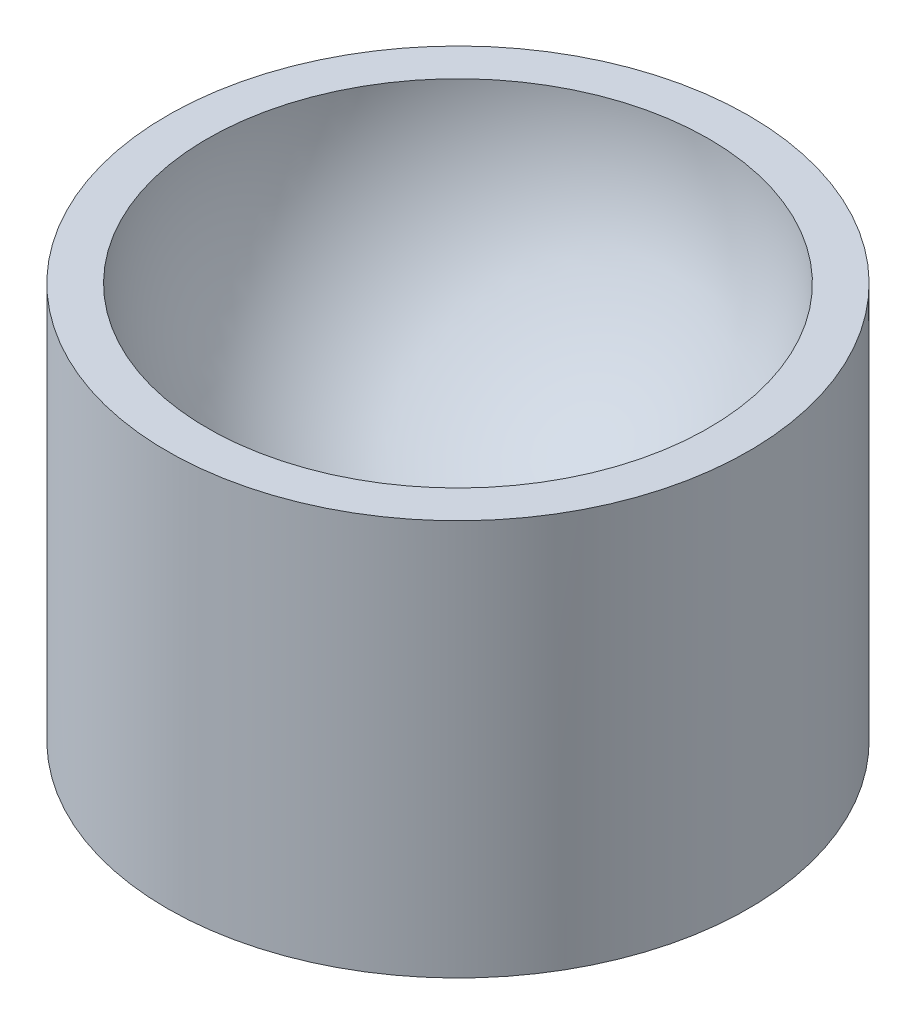
ISO-10303-21;
HEADER;
FILE_DESCRIPTION(('STEP AP214'),'2;1');
FILE_NAME('part.step','',(''),(''),'','','');
FILE_SCHEMA(('AUTOMOTIVE_DESIGN { 1 0 10303 214 1 1 1 1 }'));
ENDSEC;
DATA;
#1=APPLICATION_CONTEXT('core data for automotive mechanical design processes');
#2=APPLICATION_PROTOCOL_DEFINITION('international standard','automotive_design',2000,#1);
#3=PRODUCT_CONTEXT('',#1,'mechanical');
#4=PRODUCT('Part','Part','',(#3));
#5=PRODUCT_RELATED_PRODUCT_CATEGORY('part','',(#4));
#6=PRODUCT_DEFINITION_FORMATION('','',#4);
#7=PRODUCT_DEFINITION_CONTEXT('part definition',#1,'design');
#8=PRODUCT_DEFINITION('design','',#6,#7);
#9=PRODUCT_DEFINITION_SHAPE('','',#8);
#10=(LENGTH_UNIT() NAMED_UNIT(*) SI_UNIT(.MILLI.,.METRE.));
#11=(NAMED_UNIT(*) PLANE_ANGLE_UNIT() SI_UNIT($,.RADIAN.));
#12=(NAMED_UNIT(*) SI_UNIT($,.STERADIAN.) SOLID_ANGLE_UNIT());
#13=UNCERTAINTY_MEASURE_WITH_UNIT(LENGTH_MEASURE(1.E-05),#10,'distance_accuracy_value','');
#14=(GEOMETRIC_REPRESENTATION_CONTEXT(3) GLOBAL_UNCERTAINTY_ASSIGNED_CONTEXT((#13)) GLOBAL_UNIT_ASSIGNED_CONTEXT((#10,
#11,#12)) REPRESENTATION_CONTEXT('',''));
#15=CARTESIAN_POINT('',(0.,0.,0.));
#16=DIRECTION('',(0.,0.,1.));
#17=DIRECTION('',(1.,0.,0.));
#18=AXIS2_PLACEMENT_3D('',#15,#16,#17);
#19=CARTESIAN_POINT('',(6.5,11.5,-3.75277674973257));
#20=DIRECTION('',(-0.5,0.,0.866025403784439));
#21=DIRECTION('',(0.866025403784439,0.,0.5));
#22=AXIS2_PLACEMENT_3D('',#19,#20,#21);
#23=PLANE('',#22);
#24=DIRECTION('',(0.,-1.,0.));
#25=VECTOR('',#24,1.);
#26=CARTESIAN_POINT('',(0.,11.5,-7.50555349946514));
#27=LINE('',#26,#25);
#28=CARTESIAN_POINT('',(0.,11.5,-7.50555349946514));
#29=VERTEX_POINT('',#28);
#30=CARTESIAN_POINT('',(0.,7.,-7.50555349946514));
#31=VERTEX_POINT('',#30);
#32=EDGE_CURVE('E105',#29,#31,#27,.T.);
#33=ORIENTED_EDGE('',*,*,#32,.T.);
#34=DIRECTION('',(0.866025403784439,0.,0.5));
#35=VECTOR('',#34,1.);
#36=CARTESIAN_POINT('',(6.5,7.,-3.75277674973257));
#37=LINE('',#36,#35);
#38=CARTESIAN_POINT('',(6.5,7.,-3.75277674973257));
#39=VERTEX_POINT('',#38);
#40=EDGE_CURVE('E203',#31,#39,#37,.T.);
#41=ORIENTED_EDGE('',*,*,#40,.T.);
#42=DIRECTION('',(0.,-1.,0.));
#43=VECTOR('',#42,1.);
#44=CARTESIAN_POINT('',(6.5,11.5,-3.75277674973257));
#45=LINE('',#44,#43);
#46=CARTESIAN_POINT('',(6.5,11.5,-3.75277674973257));
#47=VERTEX_POINT('',#46);
#48=EDGE_CURVE('E214',#47,#39,#45,.T.);
#49=ORIENTED_EDGE('',*,*,#48,.F.);
#50=DIRECTION('',(-0.866025403784439,0.,-0.5));
#51=VECTOR('',#50,1.);
#52=CARTESIAN_POINT('',(6.5,11.5,-3.75277674973257));
#53=LINE('',#52,#51);
#54=EDGE_CURVE('E106',#47,#29,#53,.T.);
#55=ORIENTED_EDGE('',*,*,#54,.T.);
#56=EDGE_LOOP('',(#33,#41,#49,#55));
#57=FACE_BOUND('',#56,.T.);
#58=ADVANCED_FACE('F39',(#57),#23,.T.);
#59=CARTESIAN_POINT('',(0.,11.5,-7.50555349946514));
#60=DIRECTION('',(0.5,0.,0.866025403784439));
#61=DIRECTION('',(0.866025403784439,0.,-0.5));
#62=AXIS2_PLACEMENT_3D('',#59,#60,#61);
#63=PLANE('',#62);
#64=DIRECTION('',(0.,-1.,0.));
#65=VECTOR('',#64,1.);
#66=CARTESIAN_POINT('',(-6.5,11.5,-3.75277674973257));
#67=LINE('',#66,#65);
#68=CARTESIAN_POINT('',(-6.5,11.5,-3.75277674973257));
#69=VERTEX_POINT('',#68);
#70=CARTESIAN_POINT('',(-6.5,7.,-3.75277674973257));
#71=VERTEX_POINT('',#70);
#72=EDGE_CURVE('E103',#69,#71,#67,.T.);
#73=ORIENTED_EDGE('',*,*,#72,.T.);
#74=DIRECTION('',(0.866025403784439,0.,-0.5));
#75=VECTOR('',#74,1.);
#76=CARTESIAN_POINT('',(0.,7.,-7.50555349946514));
#77=LINE('',#76,#75);
#78=EDGE_CURVE('E201',#71,#31,#77,.T.);
#79=ORIENTED_EDGE('',*,*,#78,.T.);
#80=ORIENTED_EDGE('',*,*,#32,.F.);
#81=DIRECTION('',(-0.866025403784439,0.,0.5));
#82=VECTOR('',#81,1.);
#83=CARTESIAN_POINT('',(0.,11.5,-7.50555349946514));
#84=LINE('',#83,#82);
#85=EDGE_CURVE('E91',#29,#69,#84,.T.);
#86=ORIENTED_EDGE('',*,*,#85,.T.);
#87=EDGE_LOOP('',(#73,#79,#80,#86));
#88=FACE_BOUND('',#87,.T.);
#89=ADVANCED_FACE('F101',(#88),#63,.T.);
#90=CARTESIAN_POINT('',(-6.5,11.5,-3.75277674973257));
#91=DIRECTION('',(1.,0.,0.));
#92=DIRECTION('',(0.,0.,-1.));
#93=AXIS2_PLACEMENT_3D('',#90,#91,#92);
#94=PLANE('',#93);
#95=DIRECTION('',(0.,-1.,0.));
#96=VECTOR('',#95,1.);
#97=CARTESIAN_POINT('',(-6.5,11.5,3.75277674973257));
#98=LINE('',#97,#96);
#99=CARTESIAN_POINT('',(-6.5,11.5,3.75277674973257));
#100=VERTEX_POINT('',#99);
#101=CARTESIAN_POINT('',(-6.5,7.,3.75277674973257));
#102=VERTEX_POINT('',#101);
#103=EDGE_CURVE('E111',#100,#102,#98,.T.);
#104=ORIENTED_EDGE('',*,*,#103,.T.);
#105=DIRECTION('',(0.,0.,-1.));
#106=VECTOR('',#105,1.);
#107=CARTESIAN_POINT('',(-6.5,7.,-3.75277674973257));
#108=LINE('',#107,#106);
#109=EDGE_CURVE('E110',#102,#71,#108,.T.);
#110=ORIENTED_EDGE('',*,*,#109,.T.);
#111=ORIENTED_EDGE('',*,*,#72,.F.);
#112=DIRECTION('',(0.,0.,1.));
#113=VECTOR('',#112,1.);
#114=CARTESIAN_POINT('',(-6.5,11.5,-3.75277674973257));
#115=LINE('',#114,#113);
#116=EDGE_CURVE('E88',#69,#100,#115,.T.);
#117=ORIENTED_EDGE('',*,*,#116,.T.);
#118=EDGE_LOOP('',(#104,#110,#111,#117));
#119=FACE_BOUND('',#118,.T.);
#120=ADVANCED_FACE('F109',(#119),#94,.T.);
#121=CARTESIAN_POINT('',(-6.5,11.5,3.75277674973257));
#122=DIRECTION('',(0.5,0.,-0.866025403784439));
#123=DIRECTION('',(-0.866025403784439,0.,-0.5));
#124=AXIS2_PLACEMENT_3D('',#121,#122,#123);
#125=PLANE('',#124);
#126=DIRECTION('',(0.,-1.,0.));
#127=VECTOR('',#126,1.);
#128=CARTESIAN_POINT('',(0.,11.5,7.50555349946514));
#129=LINE('',#128,#127);
#130=CARTESIAN_POINT('',(0.,11.5,7.50555349946514));
#131=VERTEX_POINT('',#130);
#132=CARTESIAN_POINT('',(0.,7.,7.50555349946514));
#133=VERTEX_POINT('',#132);
#134=EDGE_CURVE('E114',#131,#133,#129,.T.);
#135=ORIENTED_EDGE('',*,*,#134,.T.);
#136=DIRECTION('',(-0.866025403784439,0.,-0.5));
#137=VECTOR('',#136,1.);
#138=CARTESIAN_POINT('',(-6.5,7.,3.75277674973257));
#139=LINE('',#138,#137);
#140=EDGE_CURVE('E197',#133,#102,#139,.T.);
#141=ORIENTED_EDGE('',*,*,#140,.T.);
#142=ORIENTED_EDGE('',*,*,#103,.F.);
#143=DIRECTION('',(0.866025403784439,0.,0.5));
#144=VECTOR('',#143,1.);
#145=CARTESIAN_POINT('',(-6.5,11.5,3.75277674973257));
#146=LINE('',#145,#144);
#147=EDGE_CURVE('E61',#100,#131,#146,.T.);
#148=ORIENTED_EDGE('',*,*,#147,.T.);
#149=EDGE_LOOP('',(#135,#141,#142,#148));
#150=FACE_BOUND('',#149,.T.);
#151=ADVANCED_FACE('F145',(#150),#125,.T.);
#152=CARTESIAN_POINT('',(0.,11.5,7.50555349946514));
#153=DIRECTION('',(-0.5,0.,-0.866025403784439));
#154=DIRECTION('',(-0.866025403784439,0.,0.5));
#155=AXIS2_PLACEMENT_3D('',#152,#153,#154);
#156=PLANE('',#155);
#157=DIRECTION('',(0.,-1.,0.));
#158=VECTOR('',#157,1.);
#159=CARTESIAN_POINT('',(6.5,11.5,3.75277674973257));
#160=LINE('',#159,#158);
#161=CARTESIAN_POINT('',(6.5,11.5,3.75277674973257));
#162=VERTEX_POINT('',#161);
#163=CARTESIAN_POINT('',(6.5,7.,3.75277674973257));
#164=VERTEX_POINT('',#163);
#165=EDGE_CURVE('E217',#162,#164,#160,.T.);
#166=ORIENTED_EDGE('',*,*,#165,.T.);
#167=DIRECTION('',(-0.866025403784439,0.,0.5));
#168=VECTOR('',#167,1.);
#169=CARTESIAN_POINT('',(0.,7.,7.50555349946514));
#170=LINE('',#169,#168);
#171=EDGE_CURVE('E54',#164,#133,#170,.T.);
#172=ORIENTED_EDGE('',*,*,#171,.T.);
#173=ORIENTED_EDGE('',*,*,#134,.F.);
#174=DIRECTION('',(0.866025403784439,0.,-0.5));
#175=VECTOR('',#174,1.);
#176=CARTESIAN_POINT('',(0.,11.5,7.50555349946514));
#177=LINE('',#176,#175);
#178=EDGE_CURVE('E208',#131,#162,#177,.T.);
#179=ORIENTED_EDGE('',*,*,#178,.T.);
#180=EDGE_LOOP('',(#166,#172,#173,#179));
#181=FACE_BOUND('',#180,.T.);
#182=ADVANCED_FACE('F131',(#181),#156,.T.);
#183=CARTESIAN_POINT('',(6.5,11.5,3.75277674973257));
#184=DIRECTION('',(-1.,0.,0.));
#185=DIRECTION('',(0.,0.,1.));
#186=AXIS2_PLACEMENT_3D('',#183,#184,#185);
#187=PLANE('',#186);
#188=ORIENTED_EDGE('',*,*,#48,.T.);
#189=DIRECTION('',(0.,0.,1.));
#190=VECTOR('',#189,1.);
#191=CARTESIAN_POINT('',(6.5,7.,3.75277674973257));
#192=LINE('',#191,#190);
#193=EDGE_CURVE('E11',#39,#164,#192,.T.);
#194=ORIENTED_EDGE('',*,*,#193,.T.);
#195=ORIENTED_EDGE('',*,*,#165,.F.);
#196=DIRECTION('',(0.,0.,-1.));
#197=VECTOR('',#196,1.);
#198=CARTESIAN_POINT('',(6.5,11.5,3.75277674973257));
#199=LINE('',#198,#197);
#200=EDGE_CURVE('E211',#162,#47,#199,.T.);
#201=ORIENTED_EDGE('',*,*,#200,.T.);
#202=EDGE_LOOP('',(#188,#194,#195,#201));
#203=FACE_BOUND('',#202,.T.);
#204=ADVANCED_FACE('F124',(#203),#187,.T.);
#205=CARTESIAN_POINT('',(0.,0.,0.));
#206=DIRECTION('',(0.,1.,0.));
#207=DIRECTION('',(0.,0.,1.));
#208=AXIS2_PLACEMENT_3D('',#205,#206,#207);
#209=PLANE('',#208);
#210=CARTESIAN_POINT('',(0.,0.,0.));
#211=DIRECTION('',(0.,-1.,0.));
#212=DIRECTION('',(0.,0.,-1.));
#213=AXIS2_PLACEMENT_3D('',#210,#211,#212);
#214=CIRCLE('',#213,8.);
#215=CARTESIAN_POINT('',(0.,0.,-8.));
#216=VERTEX_POINT('',#215);
#217=EDGE_CURVE('E190',#216,#216,#214,.T.);
#218=ORIENTED_EDGE('',*,*,#217,.F.);
#219=EDGE_LOOP('',(#218));
#220=FACE_BOUND('',#219,.T.);
#221=CARTESIAN_POINT('',(0.,0.,0.));
#222=DIRECTION('',(0.,1.,0.));
#223=DIRECTION('',(0.,0.,1.));
#224=AXIS2_PLACEMENT_3D('',#221,#222,#223);
#225=CIRCLE('',#224,29.);
#226=CARTESIAN_POINT('',(0.,0.,29.));
#227=VERTEX_POINT('',#226);
#228=EDGE_CURVE('E47',#227,#227,#225,.T.);
#229=ORIENTED_EDGE('',*,*,#228,.F.);
#230=EDGE_LOOP('',(#229));
#231=FACE_BOUND('',#230,.T.);
#232=ADVANCED_FACE('F122',(#220,#231),#209,.F.);
#233=CARTESIAN_POINT('',(0.,11.5,0.));
#234=DIRECTION('',(0.,-1.,0.));
#235=DIRECTION('',(0.,0.,-1.));
#236=AXIS2_PLACEMENT_3D('',#233,#234,#235);
#237=CYLINDRICAL_SURFACE('',#236,29.);
#238=ORIENTED_EDGE('',*,*,#228,.T.);
#239=EDGE_LOOP('',(#238));
#240=FACE_BOUND('',#239,.T.);
#241=CARTESIAN_POINT('',(0.,39.5,0.));
#242=DIRECTION('',(0.,-1.,0.));
#243=DIRECTION('',(0.,0.,-1.));
#244=AXIS2_PLACEMENT_3D('',#241,#242,#243);
#245=CIRCLE('',#244,29.);
#246=CARTESIAN_POINT('',(0.,39.5,-29.));
#247=VERTEX_POINT('',#246);
#248=EDGE_CURVE('E180',#247,#247,#245,.T.);
#249=ORIENTED_EDGE('',*,*,#248,.T.);
#250=EDGE_LOOP('',(#249));
#251=FACE_BOUND('',#250,.T.);
#252=ADVANCED_FACE('F41',(#240,#251),#237,.T.);
#253=CARTESIAN_POINT('',(0.,7.,0.));
#254=DIRECTION('',(0.,-1.,0.));
#255=DIRECTION('',(0.,0.,-1.));
#256=AXIS2_PLACEMENT_3D('',#253,#254,#255);
#257=CYLINDRICAL_SURFACE('',#256,8.);
#258=CARTESIAN_POINT('',(0.,7.,0.));
#259=DIRECTION('',(0.,-1.,0.));
#260=DIRECTION('',(0.,0.,-1.));
#261=AXIS2_PLACEMENT_3D('',#258,#259,#260);
#262=CIRCLE('',#261,8.);
#263=CARTESIAN_POINT('',(0.,7.,-8.));
#264=VERTEX_POINT('',#263);
#265=EDGE_CURVE('E191',#264,#264,#262,.T.);
#266=ORIENTED_EDGE('',*,*,#265,.F.);
#267=EDGE_LOOP('',(#266));
#268=FACE_BOUND('',#267,.T.);
#269=ORIENTED_EDGE('',*,*,#217,.T.);
#270=EDGE_LOOP('',(#269));
#271=FACE_BOUND('',#270,.T.);
#272=ADVANCED_FACE('F130',(#268,#271),#257,.F.);
#273=CARTESIAN_POINT('',(0.,7.,0.));
#274=DIRECTION('',(0.,-1.,0.));
#275=DIRECTION('',(0.,0.,-1.));
#276=AXIS2_PLACEMENT_3D('',#273,#274,#275);
#277=PLANE('',#276);
#278=ORIENTED_EDGE('',*,*,#78,.F.);
#279=ORIENTED_EDGE('',*,*,#109,.F.);
#280=ORIENTED_EDGE('',*,*,#140,.F.);
#281=ORIENTED_EDGE('',*,*,#171,.F.);
#282=ORIENTED_EDGE('',*,*,#193,.F.);
#283=ORIENTED_EDGE('',*,*,#40,.F.);
#284=EDGE_LOOP('',(#278,#279,#280,#281,#282,#283));
#285=FACE_BOUND('',#284,.T.);
#286=ORIENTED_EDGE('',*,*,#265,.T.);
#287=EDGE_LOOP('',(#286));
#288=FACE_BOUND('',#287,.T.);
#289=ADVANCED_FACE('F154',(#285,#288),#277,.T.);
#290=CARTESIAN_POINT('',(4.05000000000001,11.5,0.));
#291=DIRECTION('',(0.,-1.,0.));
#292=DIRECTION('',(0.,0.,-1.));
#293=AXIS2_PLACEMENT_3D('',#290,#291,#292);
#294=PLANE('',#293);
#295=CARTESIAN_POINT('',(0.,11.5,0.));
#296=DIRECTION('',(0.,-1.,0.));
#297=DIRECTION('',(0.,0.,-1.));
#298=AXIS2_PLACEMENT_3D('',#295,#296,#297);
#299=CIRCLE('',#298,4.05000000000001);
#300=CARTESIAN_POINT('',(0.,11.5,-4.05000000000001));
#301=VERTEX_POINT('',#300);
#302=EDGE_CURVE('E181',#301,#301,#299,.T.);
#303=ORIENTED_EDGE('',*,*,#302,.F.);
#304=EDGE_LOOP('',(#303));
#305=FACE_BOUND('',#304,.T.);
#306=ORIENTED_EDGE('',*,*,#85,.F.);
#307=ORIENTED_EDGE('',*,*,#54,.F.);
#308=ORIENTED_EDGE('',*,*,#200,.F.);
#309=ORIENTED_EDGE('',*,*,#178,.F.);
#310=ORIENTED_EDGE('',*,*,#147,.F.);
#311=ORIENTED_EDGE('',*,*,#116,.F.);
#312=EDGE_LOOP('',(#306,#307,#308,#309,#310,#311));
#313=FACE_BOUND('',#312,.T.);
#314=ADVANCED_FACE('F90',(#305,#313),#294,.T.);
#315=CARTESIAN_POINT('',(0.,39.5,0.));
#316=DIRECTION('',(0.,-1.,0.));
#317=DIRECTION('',(1.,0.,0.));
#318=AXIS2_PLACEMENT_3D('',#315,#316,#317);
#319=SPHERICAL_SURFACE('',#318,25.);
#320=CARTESIAN_POINT('',(0.,14.8302310509401,0.));
#321=DIRECTION('',(0.,-1.,0.));
#322=DIRECTION('',(0.,0.,-1.));
#323=AXIS2_PLACEMENT_3D('',#320,#321,#322);
#324=CIRCLE('',#323,4.05000000000001);
#325=CARTESIAN_POINT('',(0.,14.8302310509401,-4.05000000000001));
#326=VERTEX_POINT('',#325);
#327=EDGE_CURVE('E184',#326,#326,#324,.T.);
#328=ORIENTED_EDGE('',*,*,#327,.T.);
#329=EDGE_LOOP('',(#328));
#330=FACE_BOUND('',#329,.T.);
#331=CARTESIAN_POINT('',(0.,39.5,0.));
#332=DIRECTION('',(0.,-1.,0.));
#333=DIRECTION('',(0.,0.,-1.));
#334=AXIS2_PLACEMENT_3D('',#331,#332,#333);
#335=CIRCLE('',#334,25.);
#336=CARTESIAN_POINT('',(0.,39.5,-25.));
#337=VERTEX_POINT('',#336);
#338=EDGE_CURVE('E177',#337,#337,#335,.T.);
#339=ORIENTED_EDGE('',*,*,#338,.F.);
#340=EDGE_LOOP('',(#339));
#341=FACE_BOUND('',#340,.T.);
#342=ADVANCED_FACE('F158',(#330,#341),#319,.F.);
#343=CARTESIAN_POINT('',(0.,0.,0.));
#344=DIRECTION('',(0.,-1.,0.));
#345=DIRECTION('',(0.,0.,-1.));
#346=AXIS2_PLACEMENT_3D('',#343,#344,#345);
#347=CYLINDRICAL_SURFACE('',#346,4.05000000000001);
#348=ORIENTED_EDGE('',*,*,#302,.T.);
#349=EDGE_LOOP('',(#348));
#350=FACE_BOUND('',#349,.T.);
#351=ORIENTED_EDGE('',*,*,#327,.F.);
#352=EDGE_LOOP('',(#351));
#353=FACE_BOUND('',#352,.T.);
#354=ADVANCED_FACE('F161',(#350,#353),#347,.F.);
#355=CARTESIAN_POINT('',(29.,39.5,0.));
#356=DIRECTION('',(0.,1.,0.));
#357=DIRECTION('',(0.,0.,1.));
#358=AXIS2_PLACEMENT_3D('',#355,#356,#357);
#359=PLANE('',#358);
#360=ORIENTED_EDGE('',*,*,#338,.T.);
#361=EDGE_LOOP('',(#360));
#362=FACE_BOUND('',#361,.T.);
#363=ORIENTED_EDGE('',*,*,#248,.F.);
#364=EDGE_LOOP('',(#363));
#365=FACE_BOUND('',#364,.T.);
#366=ADVANCED_FACE('F165',(#362,#365),#359,.T.);
#367=CLOSED_SHELL('',(#58,#89,#120,#151,#182,#204,#232,#252,#272,#289,#314,#342,#354,#366));
#368=MANIFOLD_SOLID_BREP('B2',#367);
#369=ADVANCED_BREP_SHAPE_REPRESENTATION('',(#18,#368),#14);
#370=SHAPE_DEFINITION_REPRESENTATION(#9,#369);
ENDSEC;
END-ISO-10303-21;
